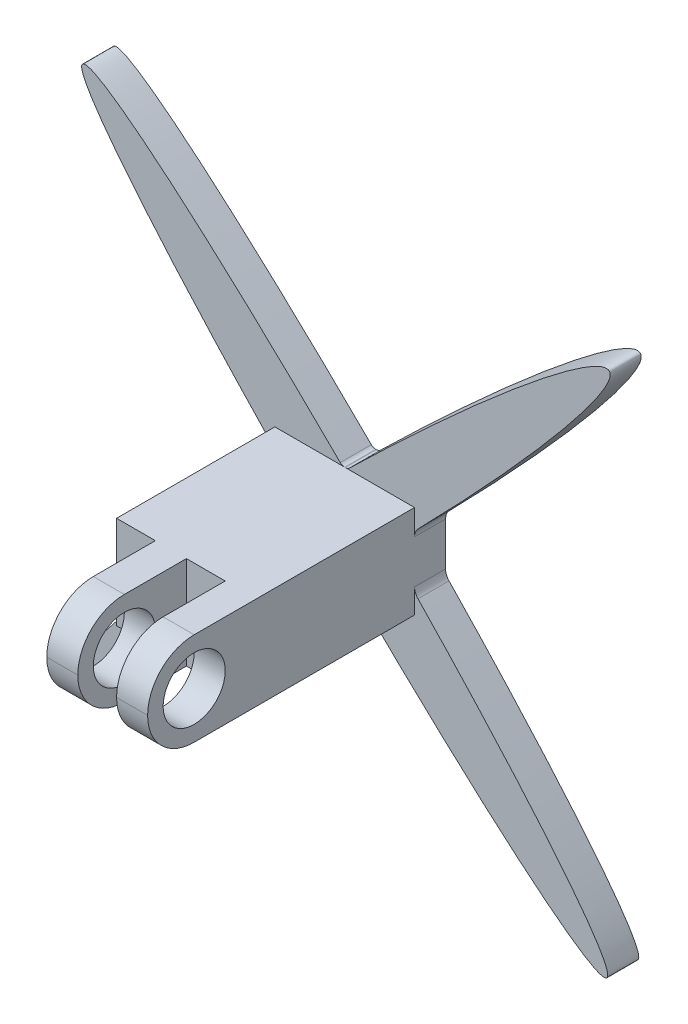
ISO-10303-21;
HEADER;
FILE_DESCRIPTION(('STEP AP214'),'2;1');
FILE_NAME('part.step','',(''),(''),'','','');
FILE_SCHEMA(('AUTOMOTIVE_DESIGN { 1 0 10303 214 1 1 1 1 }'));
ENDSEC;
DATA;
#1=APPLICATION_CONTEXT('core data for automotive mechanical design processes');
#2=APPLICATION_PROTOCOL_DEFINITION('international standard','automotive_design',2000,#1);
#3=PRODUCT_CONTEXT('',#1,'mechanical');
#4=PRODUCT('Part','Part','',(#3));
#5=PRODUCT_RELATED_PRODUCT_CATEGORY('part','',(#4));
#6=PRODUCT_DEFINITION_FORMATION('','',#4);
#7=PRODUCT_DEFINITION_CONTEXT('part definition',#1,'design');
#8=PRODUCT_DEFINITION('design','',#6,#7);
#9=PRODUCT_DEFINITION_SHAPE('','',#8);
#10=(LENGTH_UNIT() NAMED_UNIT(*) SI_UNIT(.MILLI.,.METRE.));
#11=(NAMED_UNIT(*) PLANE_ANGLE_UNIT() SI_UNIT($,.RADIAN.));
#12=(NAMED_UNIT(*) SI_UNIT($,.STERADIAN.) SOLID_ANGLE_UNIT());
#13=UNCERTAINTY_MEASURE_WITH_UNIT(LENGTH_MEASURE(1.E-05),#10,'distance_accuracy_value','');
#14=(GEOMETRIC_REPRESENTATION_CONTEXT(3) GLOBAL_UNCERTAINTY_ASSIGNED_CONTEXT((#13)) GLOBAL_UNIT_ASSIGNED_CONTEXT((#10,
#11,#12)) REPRESENTATION_CONTEXT('',''));
#15=CARTESIAN_POINT('',(0.,0.,0.));
#16=DIRECTION('',(0.,0.,1.));
#17=DIRECTION('',(1.,0.,0.));
#18=AXIS2_PLACEMENT_3D('',#15,#16,#17);
#19=CARTESIAN_POINT('',(0.,0.,6.35));
#20=DIRECTION('',(0.,0.,1.));
#21=DIRECTION('',(1.,0.,0.));
#22=AXIS2_PLACEMENT_3D('',#19,#20,#21);
#23=PLANE('',#22);
#24=DIRECTION('',(0.,-1.,0.));
#25=VECTOR('',#24,1.);
#26=CARTESIAN_POINT('',(-14.2875,-9.525,6.35));
#27=LINE('',#26,#25);
#28=CARTESIAN_POINT('',(-14.2875,9.525,6.35));
#29=VERTEX_POINT('',#28);
#30=CARTESIAN_POINT('',(-14.2875,4.53369763093799,6.35));
#31=VERTEX_POINT('',#30);
#32=EDGE_CURVE('E371',#29,#31,#27,.T.);
#33=ORIENTED_EDGE('',*,*,#32,.F.);
#34=DIRECTION('',(-1.,0.,0.));
#35=VECTOR('',#34,1.);
#36=CARTESIAN_POINT('',(14.2875,9.525,6.35));
#37=LINE('',#36,#35);
#38=CARTESIAN_POINT('',(-0.0126100173543781,9.525,6.35));
#39=VERTEX_POINT('',#38);
#40=EDGE_CURVE('E525',#39,#29,#37,.T.);
#41=ORIENTED_EDGE('',*,*,#40,.F.);
#42=CARTESIAN_POINT('',(-0.012610017354382,10.795,6.35));
#43=DIRECTION('',(0.,0.,1.));
#44=DIRECTION('',(1.,0.,0.));
#45=AXIS2_PLACEMENT_3D('',#42,#43,#44);
#46=CIRCLE('',#45,1.27);
#47=CARTESIAN_POINT('',(-0.907348939286295,9.89369968291358,6.35));
#48=VERTEX_POINT('',#47);
#49=EDGE_CURVE('E439',#39,#48,#46,.F.);
#50=ORIENTED_EDGE('',*,*,#49,.T.);
#51=CARTESIAN_POINT('',(0.,0.,6.35));
#52=DIRECTION('',(0.,0.,1.));
#53=DIRECTION('',(-0.703722375791518,0.710475064875849,0.));
#54=AXIS2_PLACEMENT_3D('',#51,#52,#53);
#55=ELLIPSE('',#54,76.2,6.35);
#56=CARTESIAN_POINT('',(-14.9932015104607,6.29066918770085,6.35));
#57=VERTEX_POINT('',#56);
#58=EDGE_CURVE('E270',#48,#57,#55,.T.);
#59=ORIENTED_EDGE('',*,*,#58,.T.);
#60=CARTESIAN_POINT('',(-16.8275,4.533697630938,6.35));
#61=DIRECTION('',(0.,0.,1.));
#62=DIRECTION('',(1.,0.,0.));
#63=AXIS2_PLACEMENT_3D('',#60,#61,#62);
#64=CIRCLE('',#63,2.54);
#65=EDGE_CURVE('E391',#57,#31,#64,.F.);
#66=ORIENTED_EDGE('',*,*,#65,.T.);
#67=EDGE_LOOP('',(#33,#41,#50,#59,#66));
#68=FACE_BOUND('',#67,.T.);
#69=ADVANCED_FACE('F39',(#68),#23,.T.);
#70=CARTESIAN_POINT('',(14.2875,9.525,6.35));
#71=VERTEX_POINT('',#70);
#72=CARTESIAN_POINT('',(0.116326815068665,9.525,6.35));
#73=VERTEX_POINT('',#72);
#74=EDGE_CURVE('E611',#71,#73,#37,.T.);
#75=ORIENTED_EDGE('',*,*,#74,.F.);
#76=DIRECTION('',(0.,1.,0.));
#77=VECTOR('',#76,1.);
#78=CARTESIAN_POINT('',(14.2875,-9.525,6.35));
#79=LINE('',#78,#77);
#80=CARTESIAN_POINT('',(14.2875,4.32923835858868,6.35));
#81=VERTEX_POINT('',#80);
#82=EDGE_CURVE('E368',#81,#71,#79,.T.);
#83=ORIENTED_EDGE('',*,*,#82,.F.);
#84=CARTESIAN_POINT('',(16.8275,4.32923835858869,6.35));
#85=DIRECTION('',(0.,0.,1.));
#86=DIRECTION('',(1.,0.,0.));
#87=AXIS2_PLACEMENT_3D('',#84,#85,#86);
#88=CIRCLE('',#87,2.54);
#89=CARTESIAN_POINT('',(15.010188507605,6.10377461902663,6.35));
#90=VERTEX_POINT('',#89);
#91=EDGE_CURVE('E393',#81,#90,#88,.F.);
#92=ORIENTED_EDGE('',*,*,#91,.T.);
#93=CARTESIAN_POINT('',(0.,0.,6.35));
#94=DIRECTION('',(0.,0.,1.));
#95=DIRECTION('',(0.710475064875849,0.703722375791518,0.));
#96=AXIS2_PLACEMENT_3D('',#93,#94,#95);
#97=ELLIPSE('',#96,76.2,6.35);
#98=CARTESIAN_POINT('',(1.00241696257042,9.88519548775558,6.35));
#99=VERTEX_POINT('',#98);
#100=EDGE_CURVE('E265',#90,#99,#97,.T.);
#101=ORIENTED_EDGE('',*,*,#100,.T.);
#102=CARTESIAN_POINT('',(0.116326815068661,10.795,6.35));
#103=DIRECTION('',(0.,0.,1.));
#104=DIRECTION('',(1.,0.,0.));
#105=AXIS2_PLACEMENT_3D('',#102,#103,#104);
#106=CIRCLE('',#105,1.27);
#107=EDGE_CURVE('E432',#99,#73,#106,.F.);
#108=ORIENTED_EDGE('',*,*,#107,.T.);
#109=EDGE_LOOP('',(#75,#83,#92,#101,#108));
#110=FACE_BOUND('',#109,.T.);
#111=ADVANCED_FACE('F333',(#110),#23,.T.);
#112=CARTESIAN_POINT('',(-14.2875,-4.32923835858868,6.35));
#113=VERTEX_POINT('',#112);
#114=CARTESIAN_POINT('',(-14.2875,-9.525,6.35));
#115=VERTEX_POINT('',#114);
#116=EDGE_CURVE('E251',#113,#115,#27,.T.);
#117=ORIENTED_EDGE('',*,*,#116,.F.);
#118=CARTESIAN_POINT('',(-16.8275,-4.32923835858868,6.35));
#119=DIRECTION('',(0.,0.,1.));
#120=DIRECTION('',(1.,0.,0.));
#121=AXIS2_PLACEMENT_3D('',#118,#119,#120);
#122=CIRCLE('',#121,2.54);
#123=CARTESIAN_POINT('',(-15.010188507605,-6.10377461902663,6.35));
#124=VERTEX_POINT('',#123);
#125=EDGE_CURVE('E363',#113,#124,#122,.F.);
#126=ORIENTED_EDGE('',*,*,#125,.T.);
#127=CARTESIAN_POINT('',(0.,0.,6.35));
#128=DIRECTION('',(0.,0.,1.));
#129=DIRECTION('',(0.710475064875849,0.703722375791518,0.));
#130=AXIS2_PLACEMENT_3D('',#127,#128,#129);
#131=ELLIPSE('',#130,76.2,6.35);
#132=CARTESIAN_POINT('',(-1.00241696257044,-9.8851954877556,6.35));
#133=VERTEX_POINT('',#132);
#134=EDGE_CURVE('E468',#124,#133,#131,.T.);
#135=ORIENTED_EDGE('',*,*,#134,.T.);
#136=CARTESIAN_POINT('',(-0.11632681506868,-10.795,6.35));
#137=DIRECTION('',(0.,0.,1.));
#138=DIRECTION('',(1.,0.,0.));
#139=AXIS2_PLACEMENT_3D('',#136,#137,#138);
#140=CIRCLE('',#139,1.27);
#141=CARTESIAN_POINT('',(-0.116326815068677,-9.525,6.35));
#142=VERTEX_POINT('',#141);
#143=EDGE_CURVE('E445',#133,#142,#140,.F.);
#144=ORIENTED_EDGE('',*,*,#143,.T.);
#145=DIRECTION('',(1.,0.,0.));
#146=VECTOR('',#145,1.);
#147=CARTESIAN_POINT('',(14.2875,-9.525,6.35));
#148=LINE('',#147,#146);
#149=EDGE_CURVE('E366',#115,#142,#148,.T.);
#150=ORIENTED_EDGE('',*,*,#149,.F.);
#151=EDGE_LOOP('',(#117,#126,#135,#144,#150));
#152=FACE_BOUND('',#151,.T.);
#153=ADVANCED_FACE('F280',(#152),#23,.T.);
#154=DIRECTION('',(0.,0.,-1.));
#155=VECTOR('',#154,1.);
#156=SURFACE_OF_LINEAR_EXTRUSION('',#97,#155);
#157=CARTESIAN_POINT('',(0.,0.,0.));
#158=DIRECTION('',(0.,0.,1.));
#159=DIRECTION('',(0.710475064875849,0.703722375791518,0.));
#160=AXIS2_PLACEMENT_3D('',#157,#158,#159);
#161=ELLIPSE('',#160,76.2,6.35);
#162=CARTESIAN_POINT('',(15.010188507605,6.10377461902663,0.));
#163=VERTEX_POINT('',#162);
#164=CARTESIAN_POINT('',(1.00241696257042,9.88519548775558,0.));
#165=VERTEX_POINT('',#164);
#166=EDGE_CURVE('E253',#163,#165,#161,.T.);
#167=ORIENTED_EDGE('',*,*,#166,.T.);
#168=DIRECTION('',(0.,0.,-1.));
#169=VECTOR('',#168,1.);
#170=CARTESIAN_POINT('',(1.00241696257042,9.88519548775558,0.));
#171=LINE('',#170,#169);
#172=EDGE_CURVE('E408',#165,#99,#171,.F.);
#173=ORIENTED_EDGE('',*,*,#172,.T.);
#174=ORIENTED_EDGE('',*,*,#100,.F.);
#175=DIRECTION('',(0.,0.,-1.));
#176=VECTOR('',#175,1.);
#177=CARTESIAN_POINT('',(15.010188507605,6.10377461902663,6.35));
#178=LINE('',#177,#176);
#179=EDGE_CURVE('E579',#90,#163,#178,.T.);
#180=ORIENTED_EDGE('',*,*,#179,.T.);
#181=EDGE_LOOP('',(#167,#173,#174,#180));
#182=FACE_BOUND('',#181,.T.);
#183=ADVANCED_FACE('F275',(#182),#156,.F.);
#184=CARTESIAN_POINT('',(0.632793389703299,9.525,6.35));
#185=DIRECTION('',(0.,-1.,0.));
#186=DIRECTION('',(1.,0.,0.));
#187=AXIS2_PLACEMENT_3D('',#184,#185,#186);
#188=PLANE('',#187);
#189=ORIENTED_EDGE('',*,*,#74,.T.);
#190=DIRECTION('',(0.,0.,1.));
#191=VECTOR('',#190,1.);
#192=CARTESIAN_POINT('',(0.116326815068665,9.525,0.));
#193=LINE('',#192,#191);
#194=CARTESIAN_POINT('',(0.116326815068665,9.525,0.));
#195=VERTEX_POINT('',#194);
#196=EDGE_CURVE('E404',#73,#195,#193,.F.);
#197=ORIENTED_EDGE('',*,*,#196,.T.);
#198=DIRECTION('',(-1.,0.,0.));
#199=VECTOR('',#198,1.);
#200=CARTESIAN_POINT('',(0.632793389703299,9.525,0.));
#201=LINE('',#200,#199);
#202=CARTESIAN_POINT('',(-0.0126100173543782,9.525,0.));
#203=VERTEX_POINT('',#202);
#204=EDGE_CURVE('E259',#195,#203,#201,.T.);
#205=ORIENTED_EDGE('',*,*,#204,.T.);
#206=DIRECTION('',(0.,0.,1.));
#207=VECTOR('',#206,1.);
#208=CARTESIAN_POINT('',(-0.0126100173543782,9.525,6.35));
#209=LINE('',#208,#207);
#210=EDGE_CURVE('E400',#203,#39,#209,.T.);
#211=ORIENTED_EDGE('',*,*,#210,.T.);
#212=ORIENTED_EDGE('',*,*,#40,.T.);
#213=DIRECTION('',(0.,0.,-1.));
#214=VECTOR('',#213,1.);
#215=CARTESIAN_POINT('',(-14.2875,9.525,60.96));
#216=LINE('',#215,#214);
#217=CARTESIAN_POINT('',(-14.2875,9.525,38.735));
#218=VERTEX_POINT('',#217);
#219=EDGE_CURVE('E630',#218,#29,#216,.T.);
#220=ORIENTED_EDGE('',*,*,#219,.F.);
#221=DIRECTION('',(1.,0.,0.));
#222=VECTOR('',#221,1.);
#223=CARTESIAN_POINT('',(0.632793389703299,9.525,38.735));
#224=LINE('',#223,#222);
#225=CARTESIAN_POINT('',(-6.34999999999998,9.52499999999997,38.735));
#226=VERTEX_POINT('',#225);
#227=EDGE_CURVE('E230',#218,#226,#224,.T.);
#228=ORIENTED_EDGE('',*,*,#227,.T.);
#229=DIRECTION('',(0.,0.,1.));
#230=VECTOR('',#229,1.);
#231=CARTESIAN_POINT('',(-6.34999999999998,9.52499999999998,6.35));
#232=LINE('',#231,#230);
#233=CARTESIAN_POINT('',(-6.34999999999998,9.52499999999998,51.435));
#234=VERTEX_POINT('',#233);
#235=EDGE_CURVE('E643',#226,#234,#232,.T.);
#236=ORIENTED_EDGE('',*,*,#235,.T.);
#237=DIRECTION('',(-1.,0.,0.));
#238=VECTOR('',#237,1.);
#239=CARTESIAN_POINT('',(0.,9.525,51.435));
#240=LINE('',#239,#238);
#241=CARTESIAN_POINT('',(0.,9.525,51.435));
#242=VERTEX_POINT('',#241);
#243=EDGE_CURVE('E553',#234,#242,#240,.F.);
#244=ORIENTED_EDGE('',*,*,#243,.T.);
#245=DIRECTION('',(0.,0.,-1.));
#246=VECTOR('',#245,1.);
#247=CARTESIAN_POINT('',(0.,9.525,6.35));
#248=LINE('',#247,#246);
#249=CARTESIAN_POINT('',(0.,9.52500000000001,38.735));
#250=VERTEX_POINT('',#249);
#251=EDGE_CURVE('E647',#242,#250,#248,.T.);
#252=ORIENTED_EDGE('',*,*,#251,.T.);
#253=DIRECTION('',(1.,0.,0.));
#254=VECTOR('',#253,1.);
#255=CARTESIAN_POINT('',(0.632793389703299,9.525,38.735));
#256=LINE('',#255,#254);
#257=CARTESIAN_POINT('',(7.93750000000002,9.52500000000001,38.735));
#258=VERTEX_POINT('',#257);
#259=EDGE_CURVE('E640',#250,#258,#256,.T.);
#260=ORIENTED_EDGE('',*,*,#259,.T.);
#261=DIRECTION('',(0.,0.,1.));
#262=VECTOR('',#261,1.);
#263=CARTESIAN_POINT('',(7.93750000000002,9.52500000000002,6.35));
#264=LINE('',#263,#262);
#265=CARTESIAN_POINT('',(7.93750000000002,9.52500000000002,51.435));
#266=VERTEX_POINT('',#265);
#267=EDGE_CURVE('E628',#258,#266,#264,.T.);
#268=ORIENTED_EDGE('',*,*,#267,.T.);
#269=DIRECTION('',(-1.,0.,0.));
#270=VECTOR('',#269,1.);
#271=CARTESIAN_POINT('',(14.2875,9.52500000000004,51.435));
#272=LINE('',#271,#270);
#273=CARTESIAN_POINT('',(14.2875,9.525,51.435));
#274=VERTEX_POINT('',#273);
#275=EDGE_CURVE('E556',#266,#274,#272,.F.);
#276=ORIENTED_EDGE('',*,*,#275,.T.);
#277=DIRECTION('',(0.,0.,-1.));
#278=VECTOR('',#277,1.);
#279=CARTESIAN_POINT('',(14.2875,9.525,60.96));
#280=LINE('',#279,#278);
#281=EDGE_CURVE('E261',#274,#71,#280,.T.);
#282=ORIENTED_EDGE('',*,*,#281,.T.);
#283=EDGE_LOOP('',(#189,#197,#205,#211,#212,#220,#228,#236,#244,#252,#260,#268,#276,#282));
#284=FACE_BOUND('',#283,.T.);
#285=ADVANCED_FACE('F279',(#284),#188,.F.);
#286=DIRECTION('',(0.,0.,-1.));
#287=VECTOR('',#286,1.);
#288=SURFACE_OF_LINEAR_EXTRUSION('',#55,#287);
#289=ORIENTED_EDGE('',*,*,#58,.F.);
#290=DIRECTION('',(0.,0.,-1.));
#291=VECTOR('',#290,1.);
#292=CARTESIAN_POINT('',(-0.907348939286295,9.89369968291358,6.35));
#293=LINE('',#292,#291);
#294=CARTESIAN_POINT('',(-0.907348939286295,9.89369968291358,0.));
#295=VERTEX_POINT('',#294);
#296=EDGE_CURVE('E411',#48,#295,#293,.T.);
#297=ORIENTED_EDGE('',*,*,#296,.T.);
#298=CARTESIAN_POINT('',(0.,0.,0.));
#299=DIRECTION('',(0.,0.,1.));
#300=DIRECTION('',(-0.703722375791518,0.710475064875849,0.));
#301=AXIS2_PLACEMENT_3D('',#298,#299,#300);
#302=ELLIPSE('',#301,76.2,6.35);
#303=CARTESIAN_POINT('',(-14.9932015104607,6.29066918770085,0.));
#304=VERTEX_POINT('',#303);
#305=EDGE_CURVE('E504',#295,#304,#302,.T.);
#306=ORIENTED_EDGE('',*,*,#305,.T.);
#307=DIRECTION('',(0.,0.,-1.));
#308=VECTOR('',#307,1.);
#309=CARTESIAN_POINT('',(-14.9932015104607,6.29066918770085,0.));
#310=LINE('',#309,#308);
#311=EDGE_CURVE('E378',#304,#57,#310,.F.);
#312=ORIENTED_EDGE('',*,*,#311,.T.);
#313=EDGE_LOOP('',(#289,#297,#306,#312));
#314=FACE_BOUND('',#313,.T.);
#315=ADVANCED_FACE('F486',(#314),#288,.F.);
#316=CARTESIAN_POINT('',(-14.2875,-5.36455020167768,6.35));
#317=DIRECTION('',(1.,0.,0.));
#318=DIRECTION('',(0.,1.,0.));
#319=AXIS2_PLACEMENT_3D('',#316,#317,#318);
#320=PLANE('',#319);
#321=DIRECTION('',(0.,-1.,0.));
#322=VECTOR('',#321,1.);
#323=CARTESIAN_POINT('',(-14.2875,-5.36455020167768,0.));
#324=LINE('',#323,#322);
#325=CARTESIAN_POINT('',(-14.2875,4.533697630938,0.));
#326=VERTEX_POINT('',#325);
#327=CARTESIAN_POINT('',(-14.2875,-4.32923835858868,0.));
#328=VERTEX_POINT('',#327);
#329=EDGE_CURVE('E376',#326,#328,#324,.T.);
#330=ORIENTED_EDGE('',*,*,#329,.T.);
#331=DIRECTION('',(0.,0.,1.));
#332=VECTOR('',#331,1.);
#333=CARTESIAN_POINT('',(-14.2875,-4.32923835858868,6.35));
#334=LINE('',#333,#332);
#335=EDGE_CURVE('E373',#328,#113,#334,.T.);
#336=ORIENTED_EDGE('',*,*,#335,.T.);
#337=ORIENTED_EDGE('',*,*,#116,.T.);
#338=DIRECTION('',(0.,0.,-1.));
#339=VECTOR('',#338,1.);
#340=CARTESIAN_POINT('',(-14.2875,-9.525,60.96));
#341=LINE('',#340,#339);
#342=CARTESIAN_POINT('',(-14.2875,-9.52499999999998,38.735));
#343=VERTEX_POINT('',#342);
#344=EDGE_CURVE('E240',#343,#115,#341,.T.);
#345=ORIENTED_EDGE('',*,*,#344,.F.);
#346=DIRECTION('',(0.,-1.,0.));
#347=VECTOR('',#346,1.);
#348=CARTESIAN_POINT('',(-14.2875,22.2250000000001,38.735));
#349=LINE('',#348,#347);
#350=EDGE_CURVE('E223',#218,#343,#349,.T.);
#351=ORIENTED_EDGE('',*,*,#350,.F.);
#352=ORIENTED_EDGE('',*,*,#219,.T.);
#353=ORIENTED_EDGE('',*,*,#32,.T.);
#354=DIRECTION('',(0.,0.,1.));
#355=VECTOR('',#354,1.);
#356=CARTESIAN_POINT('',(-14.2875,4.533697630938,0.));
#357=LINE('',#356,#355);
#358=EDGE_CURVE('E379',#31,#326,#357,.F.);
#359=ORIENTED_EDGE('',*,*,#358,.T.);
#360=EDGE_LOOP('',(#330,#336,#337,#345,#351,#352,#353,#359));
#361=FACE_BOUND('',#360,.T.);
#362=ADVANCED_FACE('F249',(#361),#320,.F.);
#363=DIRECTION('',(0.,0.,-1.));
#364=VECTOR('',#363,1.);
#365=SURFACE_OF_LINEAR_EXTRUSION('',#131,#364);
#366=CARTESIAN_POINT('',(0.,0.,0.));
#367=DIRECTION('',(0.,0.,1.));
#368=DIRECTION('',(0.710475064875849,0.703722375791518,0.));
#369=AXIS2_PLACEMENT_3D('',#366,#367,#368);
#370=ELLIPSE('',#369,76.2,6.35);
#371=CARTESIAN_POINT('',(-15.010188507605,-6.10377461902663,0.));
#372=VERTEX_POINT('',#371);
#373=CARTESIAN_POINT('',(-1.00241696257044,-9.8851954877556,0.));
#374=VERTEX_POINT('',#373);
#375=EDGE_CURVE('E458',#372,#374,#370,.T.);
#376=ORIENTED_EDGE('',*,*,#375,.T.);
#377=DIRECTION('',(0.,0.,-1.));
#378=VECTOR('',#377,1.);
#379=CARTESIAN_POINT('',(-1.00241696257044,-9.8851954877556,0.));
#380=LINE('',#379,#378);
#381=EDGE_CURVE('E423',#374,#133,#380,.F.);
#382=ORIENTED_EDGE('',*,*,#381,.T.);
#383=ORIENTED_EDGE('',*,*,#134,.F.);
#384=DIRECTION('',(0.,0.,-1.));
#385=VECTOR('',#384,1.);
#386=CARTESIAN_POINT('',(-15.010188507605,-6.10377461902663,6.35));
#387=LINE('',#386,#385);
#388=EDGE_CURVE('E383',#124,#372,#387,.T.);
#389=ORIENTED_EDGE('',*,*,#388,.T.);
#390=EDGE_LOOP('',(#376,#382,#383,#389));
#391=FACE_BOUND('',#390,.T.);
#392=ADVANCED_FACE('F481',(#391),#365,.F.);
#393=CARTESIAN_POINT('',(0.536161012241097,-9.525,6.35));
#394=DIRECTION('',(0.,1.,0.));
#395=DIRECTION('',(-1.,0.,0.));
#396=AXIS2_PLACEMENT_3D('',#393,#394,#395);
#397=PLANE('',#396);
#398=ORIENTED_EDGE('',*,*,#149,.T.);
#399=DIRECTION('',(0.,0.,1.));
#400=VECTOR('',#399,1.);
#401=CARTESIAN_POINT('',(-0.116326815068678,-9.525,0.));
#402=LINE('',#401,#400);
#403=CARTESIAN_POINT('',(-0.116326815068678,-9.525,0.));
#404=VERTEX_POINT('',#403);
#405=EDGE_CURVE('E419',#142,#404,#402,.F.);
#406=ORIENTED_EDGE('',*,*,#405,.T.);
#407=DIRECTION('',(1.,0.,0.));
#408=VECTOR('',#407,1.);
#409=CARTESIAN_POINT('',(0.536161012241097,-9.525,0.));
#410=LINE('',#409,#408);
#411=CARTESIAN_POINT('',(0.0126100173543673,-9.525,0.));
#412=VERTEX_POINT('',#411);
#413=EDGE_CURVE('E452',#404,#412,#410,.T.);
#414=ORIENTED_EDGE('',*,*,#413,.T.);
#415=DIRECTION('',(0.,0.,1.));
#416=VECTOR('',#415,1.);
#417=CARTESIAN_POINT('',(0.0126100173543674,-9.525,6.35));
#418=LINE('',#417,#416);
#419=CARTESIAN_POINT('',(0.0126100173543676,-9.525,6.35));
#420=VERTEX_POINT('',#419);
#421=EDGE_CURVE('E415',#412,#420,#418,.T.);
#422=ORIENTED_EDGE('',*,*,#421,.T.);
#423=CARTESIAN_POINT('',(14.2875,-9.525,6.35));
#424=VERTEX_POINT('',#423);
#425=EDGE_CURVE('E369',#420,#424,#148,.T.);
#426=ORIENTED_EDGE('',*,*,#425,.T.);
#427=DIRECTION('',(0.,0.,-1.));
#428=VECTOR('',#427,1.);
#429=CARTESIAN_POINT('',(14.2875,-9.525,60.96));
#430=LINE('',#429,#428);
#431=CARTESIAN_POINT('',(14.2875,-9.525,51.435));
#432=VERTEX_POINT('',#431);
#433=EDGE_CURVE('E254',#432,#424,#430,.T.);
#434=ORIENTED_EDGE('',*,*,#433,.F.);
#435=DIRECTION('',(1.,0.,0.));
#436=VECTOR('',#435,1.);
#437=CARTESIAN_POINT('',(7.9375,-9.52500000000001,51.435));
#438=LINE('',#437,#436);
#439=CARTESIAN_POINT('',(7.9375,-9.52500000000001,51.435));
#440=VERTEX_POINT('',#439);
#441=EDGE_CURVE('E531',#432,#440,#438,.F.);
#442=ORIENTED_EDGE('',*,*,#441,.T.);
#443=DIRECTION('',(0.,0.,1.));
#444=VECTOR('',#443,1.);
#445=CARTESIAN_POINT('',(7.9375,-9.52500000000001,60.96));
#446=LINE('',#445,#444);
#447=CARTESIAN_POINT('',(7.9375,-9.52500000000001,38.735));
#448=VERTEX_POINT('',#447);
#449=EDGE_CURVE('E623',#448,#440,#446,.T.);
#450=ORIENTED_EDGE('',*,*,#449,.F.);
#451=DIRECTION('',(1.,0.,0.));
#452=VECTOR('',#451,1.);
#453=CARTESIAN_POINT('',(0.,-9.525,38.735));
#454=LINE('',#453,#452);
#455=CARTESIAN_POINT('',(0.,-9.525,38.735));
#456=VERTEX_POINT('',#455);
#457=EDGE_CURVE('E660',#456,#448,#454,.T.);
#458=ORIENTED_EDGE('',*,*,#457,.F.);
#459=DIRECTION('',(0.,0.,-1.));
#460=VECTOR('',#459,1.);
#461=CARTESIAN_POINT('',(0.,-9.525,60.96));
#462=LINE('',#461,#460);
#463=CARTESIAN_POINT('',(0.,-9.525,51.435));
#464=VERTEX_POINT('',#463);
#465=EDGE_CURVE('E564',#464,#456,#462,.T.);
#466=ORIENTED_EDGE('',*,*,#465,.F.);
#467=DIRECTION('',(1.,0.,0.));
#468=VECTOR('',#467,1.);
#469=CARTESIAN_POINT('',(-6.35,-9.52499999999999,51.435));
#470=LINE('',#469,#468);
#471=CARTESIAN_POINT('',(-6.35,-9.52499999999999,51.435));
#472=VERTEX_POINT('',#471);
#473=EDGE_CURVE('E528',#464,#472,#470,.F.);
#474=ORIENTED_EDGE('',*,*,#473,.T.);
#475=DIRECTION('',(0.,0.,1.));
#476=VECTOR('',#475,1.);
#477=CARTESIAN_POINT('',(-6.35,-9.52499999999999,60.96));
#478=LINE('',#477,#476);
#479=CARTESIAN_POINT('',(-6.35,-9.52499999999999,38.735));
#480=VERTEX_POINT('',#479);
#481=EDGE_CURVE('E236',#480,#472,#478,.T.);
#482=ORIENTED_EDGE('',*,*,#481,.F.);
#483=DIRECTION('',(1.,0.,0.));
#484=VECTOR('',#483,1.);
#485=CARTESIAN_POINT('',(-14.2875,-9.52499999999998,38.735));
#486=LINE('',#485,#484);
#487=EDGE_CURVE('E227',#343,#480,#486,.T.);
#488=ORIENTED_EDGE('',*,*,#487,.F.);
#489=ORIENTED_EDGE('',*,*,#344,.T.);
#490=EDGE_LOOP('',(#398,#406,#414,#422,#426,#434,#442,#450,#458,#466,#474,#482,#488,#489));
#491=FACE_BOUND('',#490,.T.);
#492=ADVANCED_FACE('F239',(#491),#397,.F.);
#493=CARTESIAN_POINT('',(0.,0.,6.35));
#494=DIRECTION('',(0.,0.,1.));
#495=DIRECTION('',(-0.703722375791518,0.710475064875849,0.));
#496=AXIS2_PLACEMENT_3D('',#493,#494,#495);
#497=ELLIPSE('',#496,76.2,6.35);
#498=DIRECTION('',(0.,0.,-1.));
#499=VECTOR('',#498,1.);
#500=SURFACE_OF_LINEAR_EXTRUSION('',#497,#499);
#501=CARTESIAN_POINT('',(0.907348939286279,-9.89369968291356,6.35));
#502=VERTEX_POINT('',#501);
#503=CARTESIAN_POINT('',(14.9932015104607,-6.29066918770084,6.35));
#504=VERTEX_POINT('',#503);
#505=EDGE_CURVE('E462',#502,#504,#497,.T.);
#506=ORIENTED_EDGE('',*,*,#505,.F.);
#507=DIRECTION('',(0.,0.,-1.));
#508=VECTOR('',#507,1.);
#509=CARTESIAN_POINT('',(0.907348939286279,-9.89369968291356,6.35));
#510=LINE('',#509,#508);
#511=CARTESIAN_POINT('',(0.907348939286279,-9.89369968291356,0.));
#512=VERTEX_POINT('',#511);
#513=EDGE_CURVE('E426',#502,#512,#510,.T.);
#514=ORIENTED_EDGE('',*,*,#513,.T.);
#515=CARTESIAN_POINT('',(0.,0.,0.));
#516=DIRECTION('',(0.,0.,1.));
#517=DIRECTION('',(-0.703722375791518,0.710475064875849,0.));
#518=AXIS2_PLACEMENT_3D('',#515,#516,#517);
#519=ELLIPSE('',#518,76.2,6.35);
#520=CARTESIAN_POINT('',(14.9932015104607,-6.29066918770084,0.));
#521=VERTEX_POINT('',#520);
#522=EDGE_CURVE('E454',#512,#521,#519,.T.);
#523=ORIENTED_EDGE('',*,*,#522,.T.);
#524=DIRECTION('',(0.,0.,-1.));
#525=VECTOR('',#524,1.);
#526=CARTESIAN_POINT('',(14.9932015104607,-6.29066918770084,0.));
#527=LINE('',#526,#525);
#528=EDGE_CURVE('E464',#521,#504,#527,.F.);
#529=ORIENTED_EDGE('',*,*,#528,.T.);
#530=EDGE_LOOP('',(#506,#514,#523,#529));
#531=FACE_BOUND('',#530,.T.);
#532=ADVANCED_FACE('F353',(#531),#500,.F.);
#533=CARTESIAN_POINT('',(14.2875,-5.55477810805681,6.35));
#534=DIRECTION('',(-1.,0.,0.));
#535=DIRECTION('',(0.,0.,1.));
#536=AXIS2_PLACEMENT_3D('',#533,#534,#535);
#537=PLANE('',#536);
#538=CARTESIAN_POINT('',(14.2875,0.,51.435));
#539=DIRECTION('',(-1.,0.,0.));
#540=DIRECTION('',(0.,0.,1.));
#541=AXIS2_PLACEMENT_3D('',#538,#539,#540);
#542=CIRCLE('',#541,6.35);
#543=CARTESIAN_POINT('',(14.2875,0.,57.785));
#544=VERTEX_POINT('',#543);
#545=EDGE_CURVE('E569',#544,#544,#542,.T.);
#546=ORIENTED_EDGE('',*,*,#545,.T.);
#547=EDGE_LOOP('',(#546));
#548=FACE_BOUND('',#547,.T.);
#549=CARTESIAN_POINT('',(14.2875,-4.53369763093799,6.35));
#550=VERTEX_POINT('',#549);
#551=EDGE_CURVE('E609',#424,#550,#79,.T.);
#552=ORIENTED_EDGE('',*,*,#551,.T.);
#553=DIRECTION('',(0.,0.,1.));
#554=VECTOR('',#553,1.);
#555=CARTESIAN_POINT('',(14.2875,-4.53369763093799,0.));
#556=LINE('',#555,#554);
#557=CARTESIAN_POINT('',(14.2875,-4.53369763093799,0.));
#558=VERTEX_POINT('',#557);
#559=EDGE_CURVE('E573',#550,#558,#556,.F.);
#560=ORIENTED_EDGE('',*,*,#559,.T.);
#561=DIRECTION('',(0.,1.,0.));
#562=VECTOR('',#561,1.);
#563=CARTESIAN_POINT('',(14.2875,-5.55477810805681,0.));
#564=LINE('',#563,#562);
#565=CARTESIAN_POINT('',(14.2875,4.32923835858869,0.));
#566=VERTEX_POINT('',#565);
#567=EDGE_CURVE('E271',#558,#566,#564,.T.);
#568=ORIENTED_EDGE('',*,*,#567,.T.);
#569=DIRECTION('',(0.,0.,1.));
#570=VECTOR('',#569,1.);
#571=CARTESIAN_POINT('',(14.2875,4.32923835858869,6.35));
#572=LINE('',#571,#570);
#573=EDGE_CURVE('E559',#566,#81,#572,.T.);
#574=ORIENTED_EDGE('',*,*,#573,.T.);
#575=ORIENTED_EDGE('',*,*,#82,.T.);
#576=ORIENTED_EDGE('',*,*,#281,.F.);
#577=CARTESIAN_POINT('',(14.2875,0.,51.435));
#578=DIRECTION('',(-1.,0.,0.));
#579=DIRECTION('',(0.,0.,1.));
#580=AXIS2_PLACEMENT_3D('',#577,#578,#579);
#581=CIRCLE('',#580,9.525);
#582=CARTESIAN_POINT('',(14.2875,0.,60.96));
#583=VERTEX_POINT('',#582);
#584=EDGE_CURVE('E521',#274,#583,#581,.F.);
#585=ORIENTED_EDGE('',*,*,#584,.T.);
#586=CARTESIAN_POINT('',(14.2875,0.,51.435));
#587=DIRECTION('',(-1.,0.,0.));
#588=DIRECTION('',(0.,0.,1.));
#589=AXIS2_PLACEMENT_3D('',#586,#587,#588);
#590=CIRCLE('',#589,9.525);
#591=EDGE_CURVE('E524',#583,#432,#590,.F.);
#592=ORIENTED_EDGE('',*,*,#591,.T.);
#593=ORIENTED_EDGE('',*,*,#433,.T.);
#594=EDGE_LOOP('',(#552,#560,#568,#574,#575,#576,#585,#592,#593));
#595=FACE_BOUND('',#594,.T.);
#596=ADVANCED_FACE('F346',(#548,#595),#537,.F.);
#597=ORIENTED_EDGE('',*,*,#551,.F.);
#598=ORIENTED_EDGE('',*,*,#425,.F.);
#599=CARTESIAN_POINT('',(0.0126100173543655,-10.795,6.35));
#600=DIRECTION('',(0.,0.,1.));
#601=DIRECTION('',(1.,0.,0.));
#602=AXIS2_PLACEMENT_3D('',#599,#600,#601);
#603=CIRCLE('',#602,1.27);
#604=EDGE_CURVE('E11',#420,#502,#603,.F.);
#605=ORIENTED_EDGE('',*,*,#604,.T.);
#606=ORIENTED_EDGE('',*,*,#505,.T.);
#607=CARTESIAN_POINT('',(16.8275,-4.53369763093799,6.35));
#608=DIRECTION('',(0.,0.,1.));
#609=DIRECTION('',(1.,0.,0.));
#610=AXIS2_PLACEMENT_3D('',#607,#608,#609);
#611=CIRCLE('',#610,2.54);
#612=EDGE_CURVE('E592',#504,#550,#611,.F.);
#613=ORIENTED_EDGE('',*,*,#612,.T.);
#614=EDGE_LOOP('',(#597,#598,#605,#606,#613));
#615=FACE_BOUND('',#614,.T.);
#616=ADVANCED_FACE('F336',(#615),#23,.T.);
#617=CARTESIAN_POINT('',(0.,0.,0.));
#618=DIRECTION('',(0.,0.,1.));
#619=DIRECTION('',(1.,0.,0.));
#620=AXIS2_PLACEMENT_3D('',#617,#618,#619);
#621=PLANE('',#620);
#622=ORIENTED_EDGE('',*,*,#166,.F.);
#623=CARTESIAN_POINT('',(16.8275,4.32923835858869,0.));
#624=DIRECTION('',(0.,0.,1.));
#625=DIRECTION('',(1.,0.,0.));
#626=AXIS2_PLACEMENT_3D('',#623,#624,#625);
#627=CIRCLE('',#626,2.54);
#628=EDGE_CURVE('E595',#163,#566,#627,.T.);
#629=ORIENTED_EDGE('',*,*,#628,.T.);
#630=ORIENTED_EDGE('',*,*,#567,.F.);
#631=CARTESIAN_POINT('',(16.8275,-4.53369763093799,0.));
#632=DIRECTION('',(0.,0.,1.));
#633=DIRECTION('',(1.,0.,0.));
#634=AXIS2_PLACEMENT_3D('',#631,#632,#633);
#635=CIRCLE('',#634,2.54);
#636=EDGE_CURVE('E589',#558,#521,#635,.T.);
#637=ORIENTED_EDGE('',*,*,#636,.T.);
#638=ORIENTED_EDGE('',*,*,#522,.F.);
#639=CARTESIAN_POINT('',(0.0126100173543655,-10.795,0.));
#640=DIRECTION('',(0.,0.,1.));
#641=DIRECTION('',(1.,0.,0.));
#642=AXIS2_PLACEMENT_3D('',#639,#640,#641);
#643=CIRCLE('',#642,1.27);
#644=EDGE_CURVE('E48',#512,#412,#643,.T.);
#645=ORIENTED_EDGE('',*,*,#644,.T.);
#646=ORIENTED_EDGE('',*,*,#413,.F.);
#647=CARTESIAN_POINT('',(-0.11632681506868,-10.795,0.));
#648=DIRECTION('',(0.,0.,1.));
#649=DIRECTION('',(1.,0.,0.));
#650=AXIS2_PLACEMENT_3D('',#647,#648,#649);
#651=CIRCLE('',#650,1.27);
#652=EDGE_CURVE('E442',#404,#374,#651,.T.);
#653=ORIENTED_EDGE('',*,*,#652,.T.);
#654=ORIENTED_EDGE('',*,*,#375,.F.);
#655=CARTESIAN_POINT('',(-16.8275,-4.32923835858868,0.));
#656=DIRECTION('',(0.,0.,1.));
#657=DIRECTION('',(1.,0.,0.));
#658=AXIS2_PLACEMENT_3D('',#655,#656,#657);
#659=CIRCLE('',#658,2.54);
#660=EDGE_CURVE('E386',#372,#328,#659,.T.);
#661=ORIENTED_EDGE('',*,*,#660,.T.);
#662=ORIENTED_EDGE('',*,*,#329,.F.);
#663=CARTESIAN_POINT('',(-16.8275,4.533697630938,0.));
#664=DIRECTION('',(0.,0.,1.));
#665=DIRECTION('',(1.,0.,0.));
#666=AXIS2_PLACEMENT_3D('',#663,#664,#665);
#667=CIRCLE('',#666,2.54);
#668=EDGE_CURVE('E385',#326,#304,#667,.T.);
#669=ORIENTED_EDGE('',*,*,#668,.T.);
#670=ORIENTED_EDGE('',*,*,#305,.F.);
#671=CARTESIAN_POINT('',(-0.012610017354382,10.795,0.));
#672=DIRECTION('',(0.,0.,1.));
#673=DIRECTION('',(1.,0.,0.));
#674=AXIS2_PLACEMENT_3D('',#671,#672,#673);
#675=CIRCLE('',#674,1.27);
#676=EDGE_CURVE('E436',#295,#203,#675,.T.);
#677=ORIENTED_EDGE('',*,*,#676,.T.);
#678=ORIENTED_EDGE('',*,*,#204,.F.);
#679=CARTESIAN_POINT('',(0.116326815068661,10.795,0.));
#680=DIRECTION('',(0.,0.,1.));
#681=DIRECTION('',(1.,0.,0.));
#682=AXIS2_PLACEMENT_3D('',#679,#680,#681);
#683=CIRCLE('',#682,1.27);
#684=EDGE_CURVE('E429',#195,#165,#683,.T.);
#685=ORIENTED_EDGE('',*,*,#684,.T.);
#686=EDGE_LOOP('',(#622,#629,#630,#637,#638,#645,#646,#653,#654,#661,#662,#669,#670,#677,#678,#685));
#687=FACE_BOUND('',#686,.T.);
#688=ADVANCED_FACE('F345',(#687),#621,.F.);
#689=CARTESIAN_POINT('',(0.,22.225,38.735));
#690=DIRECTION('',(0.,0.,-1.));
#691=DIRECTION('',(-1.,0.,0.));
#692=AXIS2_PLACEMENT_3D('',#689,#690,#691);
#693=PLANE('',#692);
#694=DIRECTION('',(0.,-1.,0.));
#695=VECTOR('',#694,1.);
#696=CARTESIAN_POINT('',(0.,22.225,38.735));
#697=LINE('',#696,#695);
#698=EDGE_CURVE('E652',#250,#456,#697,.T.);
#699=ORIENTED_EDGE('',*,*,#698,.T.);
#700=ORIENTED_EDGE('',*,*,#457,.T.);
#701=DIRECTION('',(0.,-1.,0.));
#702=VECTOR('',#701,1.);
#703=CARTESIAN_POINT('',(7.93750000000004,22.225,38.735));
#704=LINE('',#703,#702);
#705=EDGE_CURVE('E245',#258,#448,#704,.T.);
#706=ORIENTED_EDGE('',*,*,#705,.F.);
#707=ORIENTED_EDGE('',*,*,#259,.F.);
#708=EDGE_LOOP('',(#699,#700,#706,#707));
#709=FACE_BOUND('',#708,.T.);
#710=ADVANCED_FACE('F351',(#709),#693,.F.);
#711=CARTESIAN_POINT('',(0.,22.225,60.96));
#712=DIRECTION('',(-1.,0.,0.));
#713=DIRECTION('',(0.,-1.,0.));
#714=AXIS2_PLACEMENT_3D('',#711,#712,#713);
#715=PLANE('',#714);
#716=CARTESIAN_POINT('',(0.,0.,51.435));
#717=DIRECTION('',(-1.,0.,0.));
#718=DIRECTION('',(0.,-1.,0.));
#719=AXIS2_PLACEMENT_3D('',#716,#717,#718);
#720=CIRCLE('',#719,6.35);
#721=CARTESIAN_POINT('',(0.,-6.35000000000003,51.435));
#722=VERTEX_POINT('',#721);
#723=EDGE_CURVE('E673',#722,#722,#720,.T.);
#724=ORIENTED_EDGE('',*,*,#723,.T.);
#725=EDGE_LOOP('',(#724));
#726=FACE_BOUND('',#725,.T.);
#727=CARTESIAN_POINT('',(0.,0.,51.435));
#728=DIRECTION('',(-1.,0.,0.));
#729=DIRECTION('',(0.,-1.,0.));
#730=AXIS2_PLACEMENT_3D('',#727,#728,#729);
#731=CIRCLE('',#730,9.525);
#732=CARTESIAN_POINT('',(0.,0.,60.96));
#733=VERTEX_POINT('',#732);
#734=EDGE_CURVE('E541',#242,#733,#731,.F.);
#735=ORIENTED_EDGE('',*,*,#734,.T.);
#736=CARTESIAN_POINT('',(0.,0.,51.435));
#737=DIRECTION('',(-1.,0.,0.));
#738=DIRECTION('',(0.,-1.,0.));
#739=AXIS2_PLACEMENT_3D('',#736,#737,#738);
#740=CIRCLE('',#739,9.525);
#741=EDGE_CURVE('E544',#733,#464,#740,.F.);
#742=ORIENTED_EDGE('',*,*,#741,.T.);
#743=ORIENTED_EDGE('',*,*,#465,.T.);
#744=ORIENTED_EDGE('',*,*,#698,.F.);
#745=ORIENTED_EDGE('',*,*,#251,.F.);
#746=EDGE_LOOP('',(#735,#742,#743,#744,#745));
#747=FACE_BOUND('',#746,.T.);
#748=ADVANCED_FACE('F703',(#726,#747),#715,.F.);
#749=CARTESIAN_POINT('',(7.93750000000004,22.225,60.96));
#750=DIRECTION('',(1.,0.,0.));
#751=DIRECTION('',(0.,1.,0.));
#752=AXIS2_PLACEMENT_3D('',#749,#750,#751);
#753=PLANE('',#752);
#754=CARTESIAN_POINT('',(7.93750000000001,0.,51.435));
#755=DIRECTION('',(1.,0.,0.));
#756=DIRECTION('',(0.,1.,0.));
#757=AXIS2_PLACEMENT_3D('',#754,#755,#756);
#758=CIRCLE('',#757,6.35);
#759=CARTESIAN_POINT('',(7.93750000000002,6.34999999999996,51.435));
#760=VERTEX_POINT('',#759);
#761=EDGE_CURVE('E677',#760,#760,#758,.T.);
#762=ORIENTED_EDGE('',*,*,#761,.T.);
#763=EDGE_LOOP('',(#762));
#764=FACE_BOUND('',#763,.T.);
#765=ORIENTED_EDGE('',*,*,#449,.T.);
#766=CARTESIAN_POINT('',(7.93750000000001,0.,51.435));
#767=DIRECTION('',(1.,0.,0.));
#768=DIRECTION('',(0.,1.,0.));
#769=AXIS2_PLACEMENT_3D('',#766,#767,#768);
#770=CIRCLE('',#769,9.525);
#771=CARTESIAN_POINT('',(7.93750000000001,0.,60.96));
#772=VERTEX_POINT('',#771);
#773=EDGE_CURVE('E538',#440,#772,#770,.F.);
#774=ORIENTED_EDGE('',*,*,#773,.T.);
#775=CARTESIAN_POINT('',(7.93750000000001,0.,51.435));
#776=DIRECTION('',(1.,0.,0.));
#777=DIRECTION('',(0.,1.,0.));
#778=AXIS2_PLACEMENT_3D('',#775,#776,#777);
#779=CIRCLE('',#778,9.525);
#780=EDGE_CURVE('E535',#772,#266,#779,.F.);
#781=ORIENTED_EDGE('',*,*,#780,.T.);
#782=ORIENTED_EDGE('',*,*,#267,.F.);
#783=ORIENTED_EDGE('',*,*,#705,.T.);
#784=EDGE_LOOP('',(#765,#774,#781,#782,#783));
#785=FACE_BOUND('',#784,.T.);
#786=ADVANCED_FACE('F621',(#764,#785),#753,.F.);
#787=CARTESIAN_POINT('',(-14.2875,22.2250000000001,38.735));
#788=DIRECTION('',(0.,0.,-1.));
#789=DIRECTION('',(-1.,0.,0.));
#790=AXIS2_PLACEMENT_3D('',#787,#788,#789);
#791=PLANE('',#790);
#792=ORIENTED_EDGE('',*,*,#350,.T.);
#793=ORIENTED_EDGE('',*,*,#487,.T.);
#794=DIRECTION('',(0.,-1.,0.));
#795=VECTOR('',#794,1.);
#796=CARTESIAN_POINT('',(-6.34999999999996,22.2250000000001,38.735));
#797=LINE('',#796,#795);
#798=EDGE_CURVE('E235',#226,#480,#797,.T.);
#799=ORIENTED_EDGE('',*,*,#798,.F.);
#800=ORIENTED_EDGE('',*,*,#227,.F.);
#801=EDGE_LOOP('',(#792,#793,#799,#800));
#802=FACE_BOUND('',#801,.T.);
#803=ADVANCED_FACE('F225',(#802),#791,.F.);
#804=CARTESIAN_POINT('',(-6.34999999999996,22.2250000000001,60.96));
#805=DIRECTION('',(1.,0.,0.));
#806=DIRECTION('',(0.,1.,0.));
#807=AXIS2_PLACEMENT_3D('',#804,#805,#806);
#808=PLANE('',#807);
#809=CARTESIAN_POINT('',(-6.34999999999999,0.,51.435));
#810=DIRECTION('',(-1.,0.,0.));
#811=DIRECTION('',(0.,-1.,0.));
#812=AXIS2_PLACEMENT_3D('',#809,#810,#811);
#813=CIRCLE('',#812,6.35);
#814=CARTESIAN_POINT('',(-6.35,-6.35000000000002,51.435));
#815=VERTEX_POINT('',#814);
#816=EDGE_CURVE('E681',#815,#815,#813,.T.);
#817=ORIENTED_EDGE('',*,*,#816,.F.);
#818=EDGE_LOOP('',(#817));
#819=FACE_BOUND('',#818,.T.);
#820=ORIENTED_EDGE('',*,*,#481,.T.);
#821=CARTESIAN_POINT('',(-6.34999999999999,0.,51.435));
#822=DIRECTION('',(1.,0.,0.));
#823=DIRECTION('',(0.,1.,0.));
#824=AXIS2_PLACEMENT_3D('',#821,#822,#823);
#825=CIRCLE('',#824,9.525);
#826=CARTESIAN_POINT('',(-6.34999999999999,0.,60.96));
#827=VERTEX_POINT('',#826);
#828=EDGE_CURVE('E550',#472,#827,#825,.F.);
#829=ORIENTED_EDGE('',*,*,#828,.T.);
#830=CARTESIAN_POINT('',(-6.34999999999999,0.,51.435));
#831=DIRECTION('',(1.,0.,0.));
#832=DIRECTION('',(0.,1.,0.));
#833=AXIS2_PLACEMENT_3D('',#830,#831,#832);
#834=CIRCLE('',#833,9.525);
#835=EDGE_CURVE('E547',#827,#234,#834,.F.);
#836=ORIENTED_EDGE('',*,*,#835,.T.);
#837=ORIENTED_EDGE('',*,*,#235,.F.);
#838=ORIENTED_EDGE('',*,*,#798,.T.);
#839=EDGE_LOOP('',(#820,#829,#836,#837,#838));
#840=FACE_BOUND('',#839,.T.);
#841=ADVANCED_FACE('F291',(#819,#840),#808,.F.);
#842=CARTESIAN_POINT('',(0.,0.,51.435));
#843=DIRECTION('',(1.,0.,0.));
#844=DIRECTION('',(0.,1.,0.));
#845=AXIS2_PLACEMENT_3D('',#842,#843,#844);
#846=CYLINDRICAL_SURFACE('',#845,9.525);
#847=ORIENTED_EDGE('',*,*,#275,.F.);
#848=ORIENTED_EDGE('',*,*,#780,.F.);
#849=DIRECTION('',(-1.,0.,0.));
#850=VECTOR('',#849,1.);
#851=CARTESIAN_POINT('',(7.93750000000005,0.,60.96));
#852=LINE('',#851,#850);
#853=EDGE_CURVE('E560',#583,#772,#852,.T.);
#854=ORIENTED_EDGE('',*,*,#853,.F.);
#855=ORIENTED_EDGE('',*,*,#584,.F.);
#856=EDGE_LOOP('',(#847,#848,#854,#855));
#857=FACE_BOUND('',#856,.T.);
#858=ADVANCED_FACE('F287',(#857),#846,.T.);
#859=CARTESIAN_POINT('',(0.,0.,51.435));
#860=DIRECTION('',(-1.,0.,0.));
#861=DIRECTION('',(0.,-1.,0.));
#862=AXIS2_PLACEMENT_3D('',#859,#860,#861);
#863=CYLINDRICAL_SURFACE('',#862,9.525);
#864=ORIENTED_EDGE('',*,*,#773,.F.);
#865=ORIENTED_EDGE('',*,*,#441,.F.);
#866=ORIENTED_EDGE('',*,*,#591,.F.);
#867=ORIENTED_EDGE('',*,*,#853,.T.);
#868=EDGE_LOOP('',(#864,#865,#866,#867));
#869=FACE_BOUND('',#868,.T.);
#870=ADVANCED_FACE('F283',(#869),#863,.T.);
#871=CARTESIAN_POINT('',(0.,0.,51.435));
#872=DIRECTION('',(1.,0.,0.));
#873=DIRECTION('',(0.,1.,0.));
#874=AXIS2_PLACEMENT_3D('',#871,#872,#873);
#875=CYLINDRICAL_SURFACE('',#874,9.525);
#876=ORIENTED_EDGE('',*,*,#243,.F.);
#877=ORIENTED_EDGE('',*,*,#835,.F.);
#878=DIRECTION('',(-1.,0.,0.));
#879=VECTOR('',#878,1.);
#880=CARTESIAN_POINT('',(-6.34999999999995,0.,60.96));
#881=LINE('',#880,#879);
#882=EDGE_CURVE('E565',#733,#827,#881,.T.);
#883=ORIENTED_EDGE('',*,*,#882,.F.);
#884=ORIENTED_EDGE('',*,*,#734,.F.);
#885=EDGE_LOOP('',(#876,#877,#883,#884));
#886=FACE_BOUND('',#885,.T.);
#887=ADVANCED_FACE('F286',(#886),#875,.T.);
#888=CARTESIAN_POINT('',(0.,0.,51.435));
#889=DIRECTION('',(-1.,0.,0.));
#890=DIRECTION('',(0.,-1.,0.));
#891=AXIS2_PLACEMENT_3D('',#888,#889,#890);
#892=CYLINDRICAL_SURFACE('',#891,9.525);
#893=ORIENTED_EDGE('',*,*,#828,.F.);
#894=ORIENTED_EDGE('',*,*,#473,.F.);
#895=ORIENTED_EDGE('',*,*,#741,.F.);
#896=ORIENTED_EDGE('',*,*,#882,.T.);
#897=EDGE_LOOP('',(#893,#894,#895,#896));
#898=FACE_BOUND('',#897,.T.);
#899=ADVANCED_FACE('F293',(#898),#892,.T.);
#900=CARTESIAN_POINT('',(25.4000000000001,0.,51.435));
#901=DIRECTION('',(-1.,0.,0.));
#902=DIRECTION('',(0.,-1.,0.));
#903=AXIS2_PLACEMENT_3D('',#900,#901,#902);
#904=CYLINDRICAL_SURFACE('',#903,6.35);
#905=ORIENTED_EDGE('',*,*,#816,.T.);
#906=EDGE_LOOP('',(#905));
#907=FACE_BOUND('',#906,.T.);
#908=ORIENTED_EDGE('',*,*,#723,.F.);
#909=EDGE_LOOP('',(#908));
#910=FACE_BOUND('',#909,.T.);
#911=ADVANCED_FACE('F296',(#907,#910),#904,.F.);
#912=ORIENTED_EDGE('',*,*,#761,.F.);
#913=EDGE_LOOP('',(#912));
#914=FACE_BOUND('',#913,.T.);
#915=ORIENTED_EDGE('',*,*,#545,.F.);
#916=EDGE_LOOP('',(#915));
#917=FACE_BOUND('',#916,.T.);
#918=ADVANCED_FACE('F305',(#914,#917),#904,.F.);
#919=CARTESIAN_POINT('',(16.8275,-4.53369763093799,3.175));
#920=DIRECTION('',(0.,0.,-1.));
#921=DIRECTION('',(-1.,0.,0.));
#922=AXIS2_PLACEMENT_3D('',#919,#920,#921);
#923=CYLINDRICAL_SURFACE('',#922,2.54);
#924=ORIENTED_EDGE('',*,*,#612,.F.);
#925=ORIENTED_EDGE('',*,*,#528,.F.);
#926=ORIENTED_EDGE('',*,*,#636,.F.);
#927=ORIENTED_EDGE('',*,*,#559,.F.);
#928=EDGE_LOOP('',(#924,#925,#926,#927));
#929=FACE_BOUND('',#928,.T.);
#930=ADVANCED_FACE('F301',(#929),#923,.F.);
#931=CARTESIAN_POINT('',(16.8275,4.32923835858869,3.175));
#932=DIRECTION('',(0.,0.,-1.));
#933=DIRECTION('',(-1.,0.,0.));
#934=AXIS2_PLACEMENT_3D('',#931,#932,#933);
#935=CYLINDRICAL_SURFACE('',#934,2.54);
#936=ORIENTED_EDGE('',*,*,#91,.F.);
#937=ORIENTED_EDGE('',*,*,#573,.F.);
#938=ORIENTED_EDGE('',*,*,#628,.F.);
#939=ORIENTED_EDGE('',*,*,#179,.F.);
#940=EDGE_LOOP('',(#936,#937,#938,#939));
#941=FACE_BOUND('',#940,.T.);
#942=ADVANCED_FACE('F304',(#941),#935,.F.);
#943=CARTESIAN_POINT('',(-16.8275,-4.32923835858868,3.175));
#944=DIRECTION('',(0.,0.,-1.));
#945=DIRECTION('',(-1.,0.,0.));
#946=AXIS2_PLACEMENT_3D('',#943,#944,#945);
#947=CYLINDRICAL_SURFACE('',#946,2.54);
#948=ORIENTED_EDGE('',*,*,#125,.F.);
#949=ORIENTED_EDGE('',*,*,#335,.F.);
#950=ORIENTED_EDGE('',*,*,#660,.F.);
#951=ORIENTED_EDGE('',*,*,#388,.F.);
#952=EDGE_LOOP('',(#948,#949,#950,#951));
#953=FACE_BOUND('',#952,.T.);
#954=ADVANCED_FACE('F309',(#953),#947,.F.);
#955=CARTESIAN_POINT('',(-16.8275,4.533697630938,3.175));
#956=DIRECTION('',(0.,0.,-1.));
#957=DIRECTION('',(-1.,0.,0.));
#958=AXIS2_PLACEMENT_3D('',#955,#956,#957);
#959=CYLINDRICAL_SURFACE('',#958,2.54);
#960=ORIENTED_EDGE('',*,*,#65,.F.);
#961=ORIENTED_EDGE('',*,*,#311,.F.);
#962=ORIENTED_EDGE('',*,*,#668,.F.);
#963=ORIENTED_EDGE('',*,*,#358,.F.);
#964=EDGE_LOOP('',(#960,#961,#962,#963));
#965=FACE_BOUND('',#964,.T.);
#966=ADVANCED_FACE('F313',(#965),#959,.F.);
#967=CARTESIAN_POINT('',(0.116326815068661,10.795,3.175));
#968=DIRECTION('',(0.,0.,-1.));
#969=DIRECTION('',(-1.,0.,0.));
#970=AXIS2_PLACEMENT_3D('',#967,#968,#969);
#971=CYLINDRICAL_SURFACE('',#970,1.27);
#972=ORIENTED_EDGE('',*,*,#107,.F.);
#973=ORIENTED_EDGE('',*,*,#172,.F.);
#974=ORIENTED_EDGE('',*,*,#684,.F.);
#975=ORIENTED_EDGE('',*,*,#196,.F.);
#976=EDGE_LOOP('',(#972,#973,#974,#975));
#977=FACE_BOUND('',#976,.T.);
#978=ADVANCED_FACE('F317',(#977),#971,.F.);
#979=CARTESIAN_POINT('',(-0.012610017354382,10.795,3.175));
#980=DIRECTION('',(0.,0.,-1.));
#981=DIRECTION('',(-1.,0.,0.));
#982=AXIS2_PLACEMENT_3D('',#979,#980,#981);
#983=CYLINDRICAL_SURFACE('',#982,1.27);
#984=ORIENTED_EDGE('',*,*,#49,.F.);
#985=ORIENTED_EDGE('',*,*,#210,.F.);
#986=ORIENTED_EDGE('',*,*,#676,.F.);
#987=ORIENTED_EDGE('',*,*,#296,.F.);
#988=EDGE_LOOP('',(#984,#985,#986,#987));
#989=FACE_BOUND('',#988,.T.);
#990=ADVANCED_FACE('F321',(#989),#983,.F.);
#991=CARTESIAN_POINT('',(-0.11632681506868,-10.795,3.175));
#992=DIRECTION('',(0.,0.,-1.));
#993=DIRECTION('',(-1.,0.,0.));
#994=AXIS2_PLACEMENT_3D('',#991,#992,#993);
#995=CYLINDRICAL_SURFACE('',#994,1.27);
#996=ORIENTED_EDGE('',*,*,#143,.F.);
#997=ORIENTED_EDGE('',*,*,#381,.F.);
#998=ORIENTED_EDGE('',*,*,#652,.F.);
#999=ORIENTED_EDGE('',*,*,#405,.F.);
#1000=EDGE_LOOP('',(#996,#997,#998,#999));
#1001=FACE_BOUND('',#1000,.T.);
#1002=ADVANCED_FACE('F324',(#1001),#995,.F.);
#1003=CARTESIAN_POINT('',(0.0126100173543655,-10.795,3.175));
#1004=DIRECTION('',(0.,0.,-1.));
#1005=DIRECTION('',(-1.,0.,0.));
#1006=AXIS2_PLACEMENT_3D('',#1003,#1004,#1005);
#1007=CYLINDRICAL_SURFACE('',#1006,1.27);
#1008=ORIENTED_EDGE('',*,*,#604,.F.);
#1009=ORIENTED_EDGE('',*,*,#421,.F.);
#1010=ORIENTED_EDGE('',*,*,#644,.F.);
#1011=ORIENTED_EDGE('',*,*,#513,.F.);
#1012=EDGE_LOOP('',(#1008,#1009,#1010,#1011));
#1013=FACE_BOUND('',#1012,.T.);
#1014=ADVANCED_FACE('F41',(#1013),#1007,.F.);
#1015=CLOSED_SHELL('',(#69,#111,#153,#183,#285,#315,#362,#392,#492,#532,#596,#616,#688,#710,
#748,#786,#803,#841,#858,#870,#887,#899,#911,#918,#930,#942,#954,#966,#978,#990,#1002,#1014));
#1016=MANIFOLD_SOLID_BREP('B2',#1015);
#1017=ADVANCED_BREP_SHAPE_REPRESENTATION('',(#18,#1016),#14);
#1018=SHAPE_DEFINITION_REPRESENTATION(#9,#1017);
ENDSEC;
END-ISO-10303-21;
